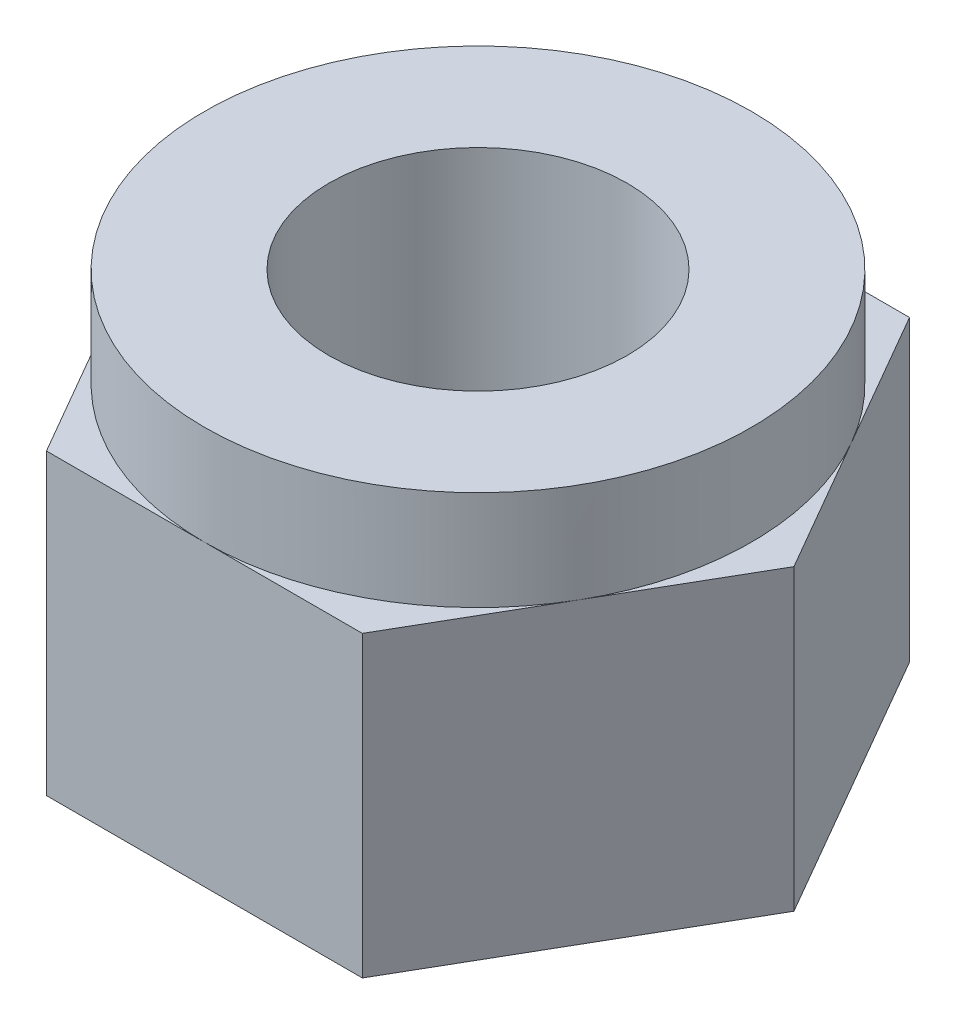
ISO-10303-21;
HEADER;
FILE_DESCRIPTION(('STEP AP214'),'2;1');
FILE_NAME('part.step','',(''),(''),'','','');
FILE_SCHEMA(('AUTOMOTIVE_DESIGN { 1 0 10303 214 1 1 1 1 }'));
ENDSEC;
DATA;
#1=APPLICATION_CONTEXT('core data for automotive mechanical design processes');
#2=APPLICATION_PROTOCOL_DEFINITION('international standard','automotive_design',2000,#1);
#3=PRODUCT_CONTEXT('',#1,'mechanical');
#4=PRODUCT('Part','Part','',(#3));
#5=PRODUCT_RELATED_PRODUCT_CATEGORY('part','',(#4));
#6=PRODUCT_DEFINITION_FORMATION('','',#4);
#7=PRODUCT_DEFINITION_CONTEXT('part definition',#1,'design');
#8=PRODUCT_DEFINITION('design','',#6,#7);
#9=PRODUCT_DEFINITION_SHAPE('','',#8);
#10=(LENGTH_UNIT() NAMED_UNIT(*) SI_UNIT(.MILLI.,.METRE.));
#11=(NAMED_UNIT(*) PLANE_ANGLE_UNIT() SI_UNIT($,.RADIAN.));
#12=(NAMED_UNIT(*) SI_UNIT($,.STERADIAN.) SOLID_ANGLE_UNIT());
#13=UNCERTAINTY_MEASURE_WITH_UNIT(LENGTH_MEASURE(1.E-05),#10,'distance_accuracy_value','');
#14=(GEOMETRIC_REPRESENTATION_CONTEXT(3) GLOBAL_UNCERTAINTY_ASSIGNED_CONTEXT((#13)) GLOBAL_UNIT_ASSIGNED_CONTEXT((#10,
#11,#12)) REPRESENTATION_CONTEXT('',''));
#15=CARTESIAN_POINT('',(0.,0.,0.));
#16=DIRECTION('',(0.,0.,1.));
#17=DIRECTION('',(1.,0.,0.));
#18=AXIS2_PLACEMENT_3D('',#15,#16,#17);
#19=CARTESIAN_POINT('',(0.,3.,0.));
#20=DIRECTION('',(0.,1.,0.));
#21=DIRECTION('',(0.,0.,1.));
#22=AXIS2_PLACEMENT_3D('',#19,#20,#21);
#23=PLANE('',#22);
#24=CARTESIAN_POINT('',(0.,3.,0.));
#25=DIRECTION('',(0.,1.,0.));
#26=DIRECTION('',(0.,0.,1.));
#27=AXIS2_PLACEMENT_3D('',#24,#25,#26);
#28=CIRCLE('',#27,2.75000000000002);
#29=CARTESIAN_POINT('',(0.,3.,2.75000000000002));
#30=VERTEX_POINT('',#29);
#31=CARTESIAN_POINT('',(2.38156986040722,3.,1.37499999999999));
#32=VERTEX_POINT('',#31);
#33=EDGE_CURVE('E54',#30,#32,#28,.T.);
#34=ORIENTED_EDGE('',*,*,#33,.F.);
#35=DIRECTION('',(1.,0.,0.));
#36=VECTOR('',#35,1.);
#37=CARTESIAN_POINT('',(-1.58771324027145,3.,2.75000000000002));
#38=LINE('',#37,#36);
#39=CARTESIAN_POINT('',(1.5877132402715,3.,2.74999999999998));
#40=VERTEX_POINT('',#39);
#41=EDGE_CURVE('E125',#30,#40,#38,.T.);
#42=ORIENTED_EDGE('',*,*,#41,.T.);
#43=DIRECTION('',(0.499999999999995,0.,-0.866025403784441));
#44=VECTOR('',#43,1.);
#45=CARTESIAN_POINT('',(1.5877132402715,3.,2.74999999999998));
#46=LINE('',#45,#44);
#47=EDGE_CURVE('E137',#40,#32,#46,.T.);
#48=ORIENTED_EDGE('',*,*,#47,.T.);
#49=EDGE_LOOP('',(#34,#42,#48));
#50=FACE_BOUND('',#49,.T.);
#51=ADVANCED_FACE('F42',(#50),#23,.T.);
#52=CARTESIAN_POINT('',(2.38156986040721,3.,-1.375));
#53=VERTEX_POINT('',#52);
#54=EDGE_CURVE('E11',#32,#53,#28,.T.);
#55=ORIENTED_EDGE('',*,*,#54,.F.);
#56=CARTESIAN_POINT('',(3.17542648054294,3.,0.));
#57=VERTEX_POINT('',#56);
#58=EDGE_CURVE('E156',#32,#57,#46,.T.);
#59=ORIENTED_EDGE('',*,*,#58,.T.);
#60=DIRECTION('',(-0.500000000000001,0.,-0.866025403784438));
#61=VECTOR('',#60,1.);
#62=CARTESIAN_POINT('',(3.17542648054294,3.,0.));
#63=LINE('',#62,#61);
#64=EDGE_CURVE('E157',#57,#53,#63,.T.);
#65=ORIENTED_EDGE('',*,*,#64,.T.);
#66=EDGE_LOOP('',(#55,#59,#65));
#67=FACE_BOUND('',#66,.T.);
#68=ADVANCED_FACE('F258',(#67),#23,.T.);
#69=CARTESIAN_POINT('',(0.,3.,-2.75));
#70=VERTEX_POINT('',#69);
#71=EDGE_CURVE('E52',#53,#70,#28,.T.);
#72=ORIENTED_EDGE('',*,*,#71,.F.);
#73=CARTESIAN_POINT('',(1.58771324027147,3.,-2.75000000000001));
#74=VERTEX_POINT('',#73);
#75=EDGE_CURVE('E155',#53,#74,#63,.T.);
#76=ORIENTED_EDGE('',*,*,#75,.T.);
#77=DIRECTION('',(-1.,0.,0.));
#78=VECTOR('',#77,1.);
#79=CARTESIAN_POINT('',(1.58771324027147,3.,-2.75000000000001));
#80=LINE('',#79,#78);
#81=EDGE_CURVE('E162',#74,#70,#80,.T.);
#82=ORIENTED_EDGE('',*,*,#81,.T.);
#83=EDGE_LOOP('',(#72,#76,#82));
#84=FACE_BOUND('',#83,.T.);
#85=ADVANCED_FACE('F262',(#84),#23,.T.);
#86=CARTESIAN_POINT('',(-2.38156986040721,3.,-1.37499999999999));
#87=VERTEX_POINT('',#86);
#88=EDGE_CURVE('E147',#70,#87,#28,.T.);
#89=ORIENTED_EDGE('',*,*,#88,.F.);
#90=CARTESIAN_POINT('',(-1.58771324027148,3.,-2.75));
#91=VERTEX_POINT('',#90);
#92=EDGE_CURVE('E161',#70,#91,#80,.T.);
#93=ORIENTED_EDGE('',*,*,#92,.T.);
#94=DIRECTION('',(-0.499999999999995,0.,0.866025403784442));
#95=VECTOR('',#94,1.);
#96=CARTESIAN_POINT('',(-1.58771324027148,3.,-2.75));
#97=LINE('',#96,#95);
#98=EDGE_CURVE('E167',#91,#87,#97,.T.);
#99=ORIENTED_EDGE('',*,*,#98,.T.);
#100=EDGE_LOOP('',(#89,#93,#99));
#101=FACE_BOUND('',#100,.T.);
#102=ADVANCED_FACE('F309',(#101),#23,.T.);
#103=CARTESIAN_POINT('',(-2.3815698604072,3.,1.37500000000002));
#104=VERTEX_POINT('',#103);
#105=EDGE_CURVE('E69',#87,#104,#28,.T.);
#106=ORIENTED_EDGE('',*,*,#105,.F.);
#107=CARTESIAN_POINT('',(-3.17542648054294,3.,0.));
#108=VERTEX_POINT('',#107);
#109=EDGE_CURVE('E166',#87,#108,#97,.T.);
#110=ORIENTED_EDGE('',*,*,#109,.T.);
#111=DIRECTION('',(0.500000000000007,0.,0.866025403784435));
#112=VECTOR('',#111,1.);
#113=CARTESIAN_POINT('',(-3.17542648054294,3.,0.));
#114=LINE('',#113,#112);
#115=EDGE_CURVE('E135',#108,#104,#114,.T.);
#116=ORIENTED_EDGE('',*,*,#115,.T.);
#117=EDGE_LOOP('',(#106,#110,#116));
#118=FACE_BOUND('',#117,.T.);
#119=ADVANCED_FACE('F228',(#118),#23,.T.);
#120=CARTESIAN_POINT('',(1.5877132402715,3.,2.74999999999998));
#121=DIRECTION('',(-0.866025403784442,0.,-0.499999999999995));
#122=DIRECTION('',(-0.499999999999995,0.,0.866025403784442));
#123=AXIS2_PLACEMENT_3D('',#120,#121,#122);
#124=PLANE('',#123);
#125=DIRECTION('',(0.499999999999995,0.,-0.866025403784441));
#126=VECTOR('',#125,1.);
#127=CARTESIAN_POINT('',(1.5877132402715,0.,2.74999999999998));
#128=LINE('',#127,#126);
#129=CARTESIAN_POINT('',(1.5877132402715,0.,2.74999999999998));
#130=VERTEX_POINT('',#129);
#131=CARTESIAN_POINT('',(3.17542648054294,0.,0.));
#132=VERTEX_POINT('',#131);
#133=EDGE_CURVE('E173',#130,#132,#128,.T.);
#134=ORIENTED_EDGE('',*,*,#133,.T.);
#135=DIRECTION('',(0.,-1.,0.));
#136=VECTOR('',#135,1.);
#137=CARTESIAN_POINT('',(3.17542648054294,3.,0.));
#138=LINE('',#137,#136);
#139=EDGE_CURVE('E46',#57,#132,#138,.T.);
#140=ORIENTED_EDGE('',*,*,#139,.F.);
#141=ORIENTED_EDGE('',*,*,#58,.F.);
#142=ORIENTED_EDGE('',*,*,#47,.F.);
#143=DIRECTION('',(0.,-1.,0.));
#144=VECTOR('',#143,1.);
#145=CARTESIAN_POINT('',(1.5877132402715,3.,2.74999999999998));
#146=LINE('',#145,#144);
#147=EDGE_CURVE('E124',#40,#130,#146,.T.);
#148=ORIENTED_EDGE('',*,*,#147,.T.);
#149=EDGE_LOOP('',(#134,#140,#141,#142,#148));
#150=FACE_BOUND('',#149,.T.);
#151=ADVANCED_FACE('F44',(#150),#124,.F.);
#152=CARTESIAN_POINT('',(3.17542648054294,3.,0.));
#153=DIRECTION('',(-0.866025403784438,0.,0.500000000000001));
#154=DIRECTION('',(0.500000000000001,0.,0.866025403784438));
#155=AXIS2_PLACEMENT_3D('',#152,#153,#154);
#156=PLANE('',#155);
#157=DIRECTION('',(-0.500000000000001,0.,-0.866025403784438));
#158=VECTOR('',#157,1.);
#159=CARTESIAN_POINT('',(3.17542648054294,0.,0.));
#160=LINE('',#159,#158);
#161=CARTESIAN_POINT('',(1.58771324027147,0.,-2.75000000000001));
#162=VERTEX_POINT('',#161);
#163=EDGE_CURVE('E177',#132,#162,#160,.T.);
#164=ORIENTED_EDGE('',*,*,#163,.T.);
#165=DIRECTION('',(0.,-1.,0.));
#166=VECTOR('',#165,1.);
#167=CARTESIAN_POINT('',(1.58771324027147,3.,-2.75000000000001));
#168=LINE('',#167,#166);
#169=EDGE_CURVE('E149',#74,#162,#168,.T.);
#170=ORIENTED_EDGE('',*,*,#169,.F.);
#171=ORIENTED_EDGE('',*,*,#75,.F.);
#172=ORIENTED_EDGE('',*,*,#64,.F.);
#173=ORIENTED_EDGE('',*,*,#139,.T.);
#174=EDGE_LOOP('',(#164,#170,#171,#172,#173));
#175=FACE_BOUND('',#174,.T.);
#176=ADVANCED_FACE('F359',(#175),#156,.F.);
#177=CARTESIAN_POINT('',(1.58771324027147,3.,-2.75000000000001));
#178=DIRECTION('',(0.,0.,1.));
#179=DIRECTION('',(1.,0.,0.));
#180=AXIS2_PLACEMENT_3D('',#177,#178,#179);
#181=PLANE('',#180);
#182=DIRECTION('',(-1.,0.,0.));
#183=VECTOR('',#182,1.);
#184=CARTESIAN_POINT('',(1.58771324027147,0.,-2.75000000000001));
#185=LINE('',#184,#183);
#186=CARTESIAN_POINT('',(-1.58771324027148,0.,-2.75));
#187=VERTEX_POINT('',#186);
#188=EDGE_CURVE('E180',#162,#187,#185,.T.);
#189=ORIENTED_EDGE('',*,*,#188,.T.);
#190=DIRECTION('',(0.,-1.,0.));
#191=VECTOR('',#190,1.);
#192=CARTESIAN_POINT('',(-1.58771324027148,3.,-2.75));
#193=LINE('',#192,#191);
#194=EDGE_CURVE('E201',#91,#187,#193,.T.);
#195=ORIENTED_EDGE('',*,*,#194,.F.);
#196=ORIENTED_EDGE('',*,*,#92,.F.);
#197=ORIENTED_EDGE('',*,*,#81,.F.);
#198=ORIENTED_EDGE('',*,*,#169,.T.);
#199=EDGE_LOOP('',(#189,#195,#196,#197,#198));
#200=FACE_BOUND('',#199,.T.);
#201=ADVANCED_FACE('F210',(#200),#181,.F.);
#202=CARTESIAN_POINT('',(-1.58771324027148,3.,-2.75));
#203=DIRECTION('',(0.866025403784441,0.,0.499999999999995));
#204=DIRECTION('',(0.499999999999995,0.,-0.866025403784442));
#205=AXIS2_PLACEMENT_3D('',#202,#203,#204);
#206=PLANE('',#205);
#207=DIRECTION('',(-0.499999999999995,0.,0.866025403784442));
#208=VECTOR('',#207,1.);
#209=CARTESIAN_POINT('',(-1.58771324027148,0.,-2.75));
#210=LINE('',#209,#208);
#211=CARTESIAN_POINT('',(-3.17542648054294,0.,0.));
#212=VERTEX_POINT('',#211);
#213=EDGE_CURVE('E183',#187,#212,#210,.T.);
#214=ORIENTED_EDGE('',*,*,#213,.T.);
#215=DIRECTION('',(0.,-1.,0.));
#216=VECTOR('',#215,1.);
#217=CARTESIAN_POINT('',(-3.17542648054294,3.,0.));
#218=LINE('',#217,#216);
#219=EDGE_CURVE('E197',#108,#212,#218,.T.);
#220=ORIENTED_EDGE('',*,*,#219,.F.);
#221=ORIENTED_EDGE('',*,*,#109,.F.);
#222=ORIENTED_EDGE('',*,*,#98,.F.);
#223=ORIENTED_EDGE('',*,*,#194,.T.);
#224=EDGE_LOOP('',(#214,#220,#221,#222,#223));
#225=FACE_BOUND('',#224,.T.);
#226=ADVANCED_FACE('F223',(#225),#206,.F.);
#227=CARTESIAN_POINT('',(-3.17542648054294,3.,0.));
#228=DIRECTION('',(0.866025403784435,0.,-0.500000000000007));
#229=DIRECTION('',(-0.500000000000007,0.,-0.866025403784434));
#230=AXIS2_PLACEMENT_3D('',#227,#228,#229);
#231=PLANE('',#230);
#232=DIRECTION('',(0.500000000000007,0.,0.866025403784435));
#233=VECTOR('',#232,1.);
#234=CARTESIAN_POINT('',(-3.17542648054294,0.,0.));
#235=LINE('',#234,#233);
#236=CARTESIAN_POINT('',(-1.58771324027145,0.,2.75000000000002));
#237=VERTEX_POINT('',#236);
#238=EDGE_CURVE('E186',#212,#237,#235,.T.);
#239=ORIENTED_EDGE('',*,*,#238,.T.);
#240=DIRECTION('',(0.,-1.,0.));
#241=VECTOR('',#240,1.);
#242=CARTESIAN_POINT('',(-1.58771324027145,3.,2.75000000000002));
#243=LINE('',#242,#241);
#244=CARTESIAN_POINT('',(-1.58771324027145,3.,2.75000000000002));
#245=VERTEX_POINT('',#244);
#246=EDGE_CURVE('E194',#245,#237,#243,.T.);
#247=ORIENTED_EDGE('',*,*,#246,.F.);
#248=EDGE_CURVE('E119',#104,#245,#114,.T.);
#249=ORIENTED_EDGE('',*,*,#248,.F.);
#250=ORIENTED_EDGE('',*,*,#115,.F.);
#251=ORIENTED_EDGE('',*,*,#219,.T.);
#252=EDGE_LOOP('',(#239,#247,#249,#250,#251));
#253=FACE_BOUND('',#252,.T.);
#254=ADVANCED_FACE('F227',(#253),#231,.F.);
#255=CARTESIAN_POINT('',(-1.58771324027145,3.,2.75000000000002));
#256=DIRECTION('',(0.,0.,-1.));
#257=DIRECTION('',(-1.,0.,0.));
#258=AXIS2_PLACEMENT_3D('',#255,#256,#257);
#259=PLANE('',#258);
#260=DIRECTION('',(1.,0.,0.));
#261=VECTOR('',#260,1.);
#262=CARTESIAN_POINT('',(-1.58771324027145,0.,2.75000000000002));
#263=LINE('',#262,#261);
#264=EDGE_CURVE('E189',#237,#130,#263,.T.);
#265=ORIENTED_EDGE('',*,*,#264,.T.);
#266=ORIENTED_EDGE('',*,*,#147,.F.);
#267=ORIENTED_EDGE('',*,*,#41,.F.);
#268=EDGE_CURVE('E116',#245,#30,#38,.T.);
#269=ORIENTED_EDGE('',*,*,#268,.F.);
#270=ORIENTED_EDGE('',*,*,#246,.T.);
#271=EDGE_LOOP('',(#265,#266,#267,#269,#270));
#272=FACE_BOUND('',#271,.T.);
#273=ADVANCED_FACE('F129',(#272),#259,.F.);
#274=EDGE_CURVE('E61',#104,#30,#28,.T.);
#275=ORIENTED_EDGE('',*,*,#274,.F.);
#276=ORIENTED_EDGE('',*,*,#248,.T.);
#277=ORIENTED_EDGE('',*,*,#268,.T.);
#278=EDGE_LOOP('',(#275,#276,#277));
#279=FACE_BOUND('',#278,.T.);
#280=ADVANCED_FACE('F118',(#279),#23,.T.);
#281=CARTESIAN_POINT('',(0.,0.,0.));
#282=DIRECTION('',(0.,1.,0.));
#283=DIRECTION('',(0.,0.,1.));
#284=AXIS2_PLACEMENT_3D('',#281,#282,#283);
#285=PLANE('',#284);
#286=CARTESIAN_POINT('',(0.,0.,0.));
#287=DIRECTION('',(0.,-1.,0.));
#288=DIRECTION('',(0.,0.,-1.));
#289=AXIS2_PLACEMENT_3D('',#286,#287,#288);
#290=CIRCLE('',#289,1.5);
#291=CARTESIAN_POINT('',(0.,0.,-1.5));
#292=VERTEX_POINT('',#291);
#293=EDGE_CURVE('E239',#292,#292,#290,.T.);
#294=ORIENTED_EDGE('',*,*,#293,.F.);
#295=EDGE_LOOP('',(#294));
#296=FACE_BOUND('',#295,.T.);
#297=ORIENTED_EDGE('',*,*,#133,.F.);
#298=ORIENTED_EDGE('',*,*,#264,.F.);
#299=ORIENTED_EDGE('',*,*,#238,.F.);
#300=ORIENTED_EDGE('',*,*,#213,.F.);
#301=ORIENTED_EDGE('',*,*,#188,.F.);
#302=ORIENTED_EDGE('',*,*,#163,.F.);
#303=EDGE_LOOP('',(#297,#298,#299,#300,#301,#302));
#304=FACE_BOUND('',#303,.T.);
#305=ADVANCED_FACE('F218',(#296,#304),#285,.F.);
#306=CARTESIAN_POINT('',(0.,4.,0.));
#307=DIRECTION('',(0.,-1.,0.));
#308=DIRECTION('',(0.,0.,-1.));
#309=AXIS2_PLACEMENT_3D('',#306,#307,#308);
#310=CYLINDRICAL_SURFACE('',#309,2.75000000000002);
#311=CARTESIAN_POINT('',(0.,4.,0.));
#312=DIRECTION('',(0.,1.,0.));
#313=DIRECTION('',(0.,0.,1.));
#314=AXIS2_PLACEMENT_3D('',#311,#312,#313);
#315=CIRCLE('',#314,2.75000000000002);
#316=CARTESIAN_POINT('',(0.,4.,2.75000000000002));
#317=VERTEX_POINT('',#316);
#318=EDGE_CURVE('E140',#317,#317,#315,.T.);
#319=ORIENTED_EDGE('',*,*,#318,.F.);
#320=EDGE_LOOP('',(#319));
#321=FACE_BOUND('',#320,.T.);
#322=ORIENTED_EDGE('',*,*,#33,.T.);
#323=ORIENTED_EDGE('',*,*,#54,.T.);
#324=ORIENTED_EDGE('',*,*,#71,.T.);
#325=ORIENTED_EDGE('',*,*,#88,.T.);
#326=ORIENTED_EDGE('',*,*,#105,.T.);
#327=ORIENTED_EDGE('',*,*,#274,.T.);
#328=EDGE_LOOP('',(#322,#323,#324,#325,#326,#327));
#329=FACE_BOUND('',#328,.T.);
#330=ADVANCED_FACE('F142',(#321,#329),#310,.T.);
#331=CARTESIAN_POINT('',(0.,4.,0.));
#332=DIRECTION('',(0.,1.,0.));
#333=DIRECTION('',(0.,0.,1.));
#334=AXIS2_PLACEMENT_3D('',#331,#332,#333);
#335=PLANE('',#334);
#336=CARTESIAN_POINT('',(0.,4.,0.));
#337=DIRECTION('',(0.,-1.,0.));
#338=DIRECTION('',(0.,0.,-1.));
#339=AXIS2_PLACEMENT_3D('',#336,#337,#338);
#340=CIRCLE('',#339,1.5);
#341=CARTESIAN_POINT('',(0.,4.,-1.5));
#342=VERTEX_POINT('',#341);
#343=EDGE_CURVE('E141',#342,#342,#340,.T.);
#344=ORIENTED_EDGE('',*,*,#343,.T.);
#345=EDGE_LOOP('',(#344));
#346=FACE_BOUND('',#345,.T.);
#347=ORIENTED_EDGE('',*,*,#318,.T.);
#348=EDGE_LOOP('',(#347));
#349=FACE_BOUND('',#348,.T.);
#350=ADVANCED_FACE('F252',(#346,#349),#335,.T.);
#351=CARTESIAN_POINT('',(0.,4.,0.));
#352=DIRECTION('',(0.,-1.,0.));
#353=DIRECTION('',(0.,0.,-1.));
#354=AXIS2_PLACEMENT_3D('',#351,#352,#353);
#355=CYLINDRICAL_SURFACE('',#354,1.5);
#356=ORIENTED_EDGE('',*,*,#343,.F.);
#357=EDGE_LOOP('',(#356));
#358=FACE_BOUND('',#357,.T.);
#359=ORIENTED_EDGE('',*,*,#293,.T.);
#360=EDGE_LOOP('',(#359));
#361=FACE_BOUND('',#360,.T.);
#362=ADVANCED_FACE('F244',(#358,#361),#355,.F.);
#363=CLOSED_SHELL('',(#51,#68,#85,#102,#119,#151,#176,#201,#226,#254,#273,#280,#305,#330,#350,#362));
#364=MANIFOLD_SOLID_BREP('B2',#363);
#365=ADVANCED_BREP_SHAPE_REPRESENTATION('',(#18,#364),#14);
#366=SHAPE_DEFINITION_REPRESENTATION(#9,#365);
ENDSEC;
END-ISO-10303-21;
